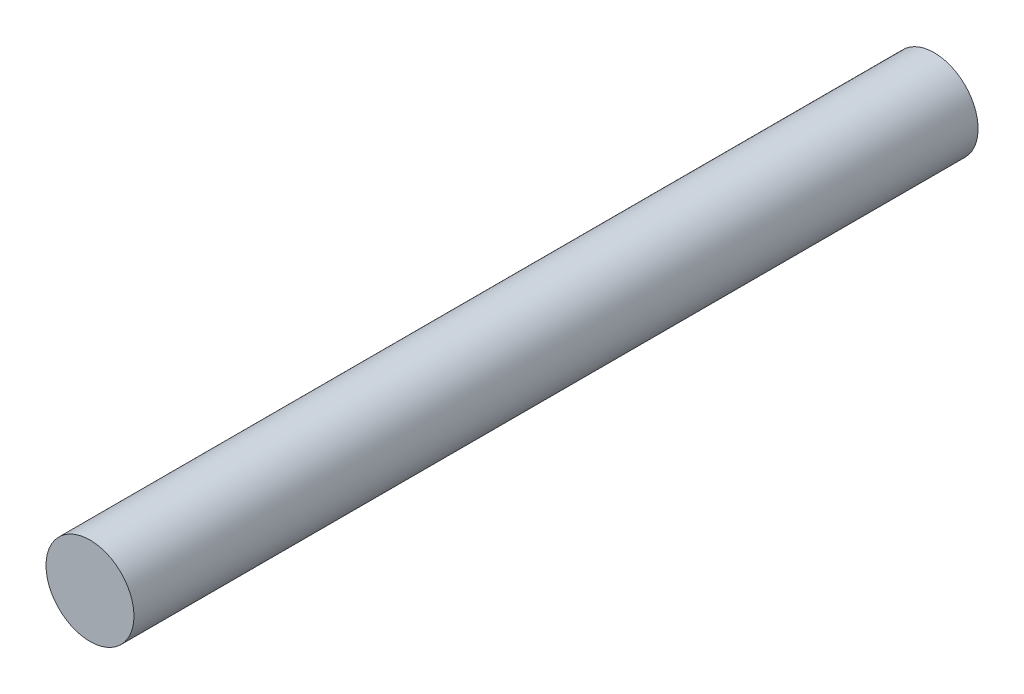
ISO-10303-21;
HEADER;
FILE_DESCRIPTION(('STEP AP214'),'2;1');
FILE_NAME('part.step','',(''),(''),'','','');
FILE_SCHEMA(('AUTOMOTIVE_DESIGN { 1 0 10303 214 1 1 1 1 }'));
ENDSEC;
DATA;
#1=APPLICATION_CONTEXT('core data for automotive mechanical design processes');
#2=APPLICATION_PROTOCOL_DEFINITION('international standard','automotive_design',2000,#1);
#3=PRODUCT_CONTEXT('',#1,'mechanical');
#4=PRODUCT('Part','Part','',(#3));
#5=PRODUCT_RELATED_PRODUCT_CATEGORY('part','',(#4));
#6=PRODUCT_DEFINITION_FORMATION('','',#4);
#7=PRODUCT_DEFINITION_CONTEXT('part definition',#1,'design');
#8=PRODUCT_DEFINITION('design','',#6,#7);
#9=PRODUCT_DEFINITION_SHAPE('','',#8);
#10=(LENGTH_UNIT() NAMED_UNIT(*) SI_UNIT(.MILLI.,.METRE.));
#11=(NAMED_UNIT(*) PLANE_ANGLE_UNIT() SI_UNIT($,.RADIAN.));
#12=(NAMED_UNIT(*) SI_UNIT($,.STERADIAN.) SOLID_ANGLE_UNIT());
#13=UNCERTAINTY_MEASURE_WITH_UNIT(LENGTH_MEASURE(1.E-05),#10,'distance_accuracy_value','');
#14=(GEOMETRIC_REPRESENTATION_CONTEXT(3) GLOBAL_UNCERTAINTY_ASSIGNED_CONTEXT((#13)) GLOBAL_UNIT_ASSIGNED_CONTEXT((#10,
#11,#12)) REPRESENTATION_CONTEXT('',''));
#15=CARTESIAN_POINT('',(0.,0.,0.));
#16=DIRECTION('',(0.,0.,1.));
#17=DIRECTION('',(1.,0.,0.));
#18=AXIS2_PLACEMENT_3D('',#15,#16,#17);
#19=CARTESIAN_POINT('',(0.,0.,60.96));
#20=DIRECTION('',(0.,0.,-1.));
#21=DIRECTION('',(-1.,0.,0.));
#22=AXIS2_PLACEMENT_3D('',#19,#20,#21);
#23=CYLINDRICAL_SURFACE('',#22,3.175);
#24=CARTESIAN_POINT('',(0.,0.,60.96));
#25=DIRECTION('',(0.,0.,1.));
#26=DIRECTION('',(1.,0.,0.));
#27=AXIS2_PLACEMENT_3D('',#24,#25,#26);
#28=CIRCLE('',#27,3.175);
#29=CARTESIAN_POINT('',(-3.175,0.,60.96));
#30=VERTEX_POINT('',#29);
#31=EDGE_CURVE('E10',#30,#30,#28,.T.);
#32=CARTESIAN_POINT('',(0.,0.,0.));
#33=DIRECTION('',(0.,0.,1.));
#34=DIRECTION('',(1.,0.,0.));
#35=AXIS2_PLACEMENT_3D('',#32,#33,#34);
#36=CIRCLE('',#35,3.175);
#37=CARTESIAN_POINT('',(-3.175,0.,0.));
#38=VERTEX_POINT('',#37);
#39=EDGE_CURVE('E34',#38,#38,#36,.T.);
#40=CARTESIAN_POINT('',(-3.175,0.,60.96));
#41=CARTESIAN_POINT('',(-3.175,0.,60.325));
#42=CARTESIAN_POINT('',(-3.175,0.,59.69));
#43=CARTESIAN_POINT('',(-3.175,0.,58.42));
#44=CARTESIAN_POINT('',(-3.175,0.,57.785));
#45=CARTESIAN_POINT('',(-3.175,0.,56.515));
#46=CARTESIAN_POINT('',(-3.175,0.,55.88));
#47=CARTESIAN_POINT('',(-3.175,0.,54.61));
#48=CARTESIAN_POINT('',(-3.175,0.,53.975));
#49=CARTESIAN_POINT('',(-3.175,0.,52.705));
#50=CARTESIAN_POINT('',(-3.175,0.,52.07));
#51=CARTESIAN_POINT('',(-3.175,0.,50.8));
#52=CARTESIAN_POINT('',(-3.175,0.,50.165));
#53=CARTESIAN_POINT('',(-3.175,0.,48.895));
#54=CARTESIAN_POINT('',(-3.175,0.,48.26));
#55=CARTESIAN_POINT('',(-3.175,0.,46.99));
#56=CARTESIAN_POINT('',(-3.175,0.,46.355));
#57=CARTESIAN_POINT('',(-3.175,0.,45.085));
#58=CARTESIAN_POINT('',(-3.175,0.,44.45));
#59=CARTESIAN_POINT('',(-3.175,0.,43.18));
#60=CARTESIAN_POINT('',(-3.175,0.,42.545));
#61=CARTESIAN_POINT('',(-3.175,0.,41.275));
#62=CARTESIAN_POINT('',(-3.175,0.,40.64));
#63=CARTESIAN_POINT('',(-3.175,0.,39.37));
#64=CARTESIAN_POINT('',(-3.175,0.,38.735));
#65=CARTESIAN_POINT('',(-3.175,0.,37.465));
#66=CARTESIAN_POINT('',(-3.175,0.,36.83));
#67=CARTESIAN_POINT('',(-3.175,0.,35.56));
#68=CARTESIAN_POINT('',(-3.175,0.,34.925));
#69=CARTESIAN_POINT('',(-3.175,0.,33.655));
#70=CARTESIAN_POINT('',(-3.175,0.,33.02));
#71=CARTESIAN_POINT('',(-3.175,0.,31.75));
#72=CARTESIAN_POINT('',(-3.175,0.,31.115));
#73=CARTESIAN_POINT('',(-3.175,0.,29.845));
#74=CARTESIAN_POINT('',(-3.175,0.,29.21));
#75=CARTESIAN_POINT('',(-3.175,0.,27.94));
#76=CARTESIAN_POINT('',(-3.175,0.,27.305));
#77=CARTESIAN_POINT('',(-3.175,0.,26.035));
#78=CARTESIAN_POINT('',(-3.175,0.,25.4));
#79=CARTESIAN_POINT('',(-3.175,0.,24.13));
#80=CARTESIAN_POINT('',(-3.175,0.,23.495));
#81=CARTESIAN_POINT('',(-3.175,0.,22.225));
#82=CARTESIAN_POINT('',(-3.175,0.,21.59));
#83=CARTESIAN_POINT('',(-3.175,0.,20.32));
#84=CARTESIAN_POINT('',(-3.175,0.,19.685));
#85=CARTESIAN_POINT('',(-3.175,0.,18.415));
#86=CARTESIAN_POINT('',(-3.175,0.,17.78));
#87=CARTESIAN_POINT('',(-3.175,0.,16.51));
#88=CARTESIAN_POINT('',(-3.175,0.,15.875));
#89=CARTESIAN_POINT('',(-3.175,0.,14.605));
#90=CARTESIAN_POINT('',(-3.175,0.,13.97));
#91=CARTESIAN_POINT('',(-3.175,0.,12.7));
#92=CARTESIAN_POINT('',(-3.175,0.,12.065));
#93=CARTESIAN_POINT('',(-3.175,0.,10.795));
#94=CARTESIAN_POINT('',(-3.175,0.,10.16));
#95=CARTESIAN_POINT('',(-3.175,0.,8.89));
#96=CARTESIAN_POINT('',(-3.175,0.,8.255));
#97=CARTESIAN_POINT('',(-3.175,0.,6.985));
#98=CARTESIAN_POINT('',(-3.175,0.,6.35));
#99=CARTESIAN_POINT('',(-3.175,0.,5.08));
#100=CARTESIAN_POINT('',(-3.175,0.,4.445));
#101=CARTESIAN_POINT('',(-3.175,0.,3.175));
#102=CARTESIAN_POINT('',(-3.175,0.,2.54));
#103=CARTESIAN_POINT('',(-3.175,0.,1.27));
#104=CARTESIAN_POINT('',(-3.175,0.,0.634999999999999));
#105=CARTESIAN_POINT('',(-3.175,0.,0.));
#106=B_SPLINE_CURVE_WITH_KNOTS('',3,(#40,#41,#42,#43,#44,#45,#46,#47,#48,#49,#50,#51,#52,#53,
#54,#55,#56,#57,#58,#59,#60,#61,#62,#63,#64,#65,#66,#67,#68,#69,#70,#71,#72,#73,#74,#75,#76,#77,
#78,#79,#80,#81,#82,#83,#84,#85,#86,#87,#88,#89,#90,#91,#92,#93,#94,#95,#96,#97,#98,#99,#100,
#101,#102,#103,#104,#105),.UNSPECIFIED.,.F.,.F.,(4,2,2,2,2,2,2,2,2,2,2,2,2,2,2,2,2,2,2,2,2,2,2,
2,2,2,2,2,2,2,2,2,4),(0.,1.905,3.81,5.71500000000001,7.62,9.525,11.43,13.335,15.24,17.145,19.05,
20.955,22.86,24.765,26.67,28.575,30.48,32.385,34.29,36.195,38.1,40.005,41.91,43.815,45.72,
47.625,49.53,51.435,53.34,55.245,57.15,59.055,60.96),.UNSPECIFIED.);
#107=EDGE_CURVE('BSEAM31',#30,#38,#106,.T.);
#108=ORIENTED_EDGE('',*,*,#31,.F.);
#109=ORIENTED_EDGE('',*,*,#39,.T.);
#110=ORIENTED_EDGE('',*,*,#107,.T.);
#111=ORIENTED_EDGE('',*,*,#107,.F.);
#112=EDGE_LOOP('',(#108,#110,#109,#111));
#113=FACE_BOUND('',#112,.T.);
#114=ADVANCED_FACE('F31',(#113),#23,.T.);
#115=CARTESIAN_POINT('',(0.,0.,60.96));
#116=DIRECTION('',(0.,0.,1.));
#117=DIRECTION('',(1.,0.,0.));
#118=AXIS2_PLACEMENT_3D('',#115,#116,#117);
#119=PLANE('',#118);
#120=ORIENTED_EDGE('',*,*,#31,.T.);
#121=EDGE_LOOP('',(#120));
#122=FACE_BOUND('',#121,.T.);
#123=ADVANCED_FACE('F46',(#122),#119,.T.);
#124=CARTESIAN_POINT('',(0.,0.,0.));
#125=DIRECTION('',(0.,0.,1.));
#126=DIRECTION('',(1.,0.,0.));
#127=AXIS2_PLACEMENT_3D('',#124,#125,#126);
#128=PLANE('',#127);
#129=ORIENTED_EDGE('',*,*,#39,.F.);
#130=EDGE_LOOP('',(#129));
#131=FACE_BOUND('',#130,.T.);
#132=ADVANCED_FACE('F44',(#131),#128,.F.);
#133=CLOSED_SHELL('',(#114,#123,#132));
#134=MANIFOLD_SOLID_BREP('B2',#133);
#135=ADVANCED_BREP_SHAPE_REPRESENTATION('',(#18,#134),#14);
#136=SHAPE_DEFINITION_REPRESENTATION(#9,#135);
ENDSEC;
END-ISO-10303-21;
